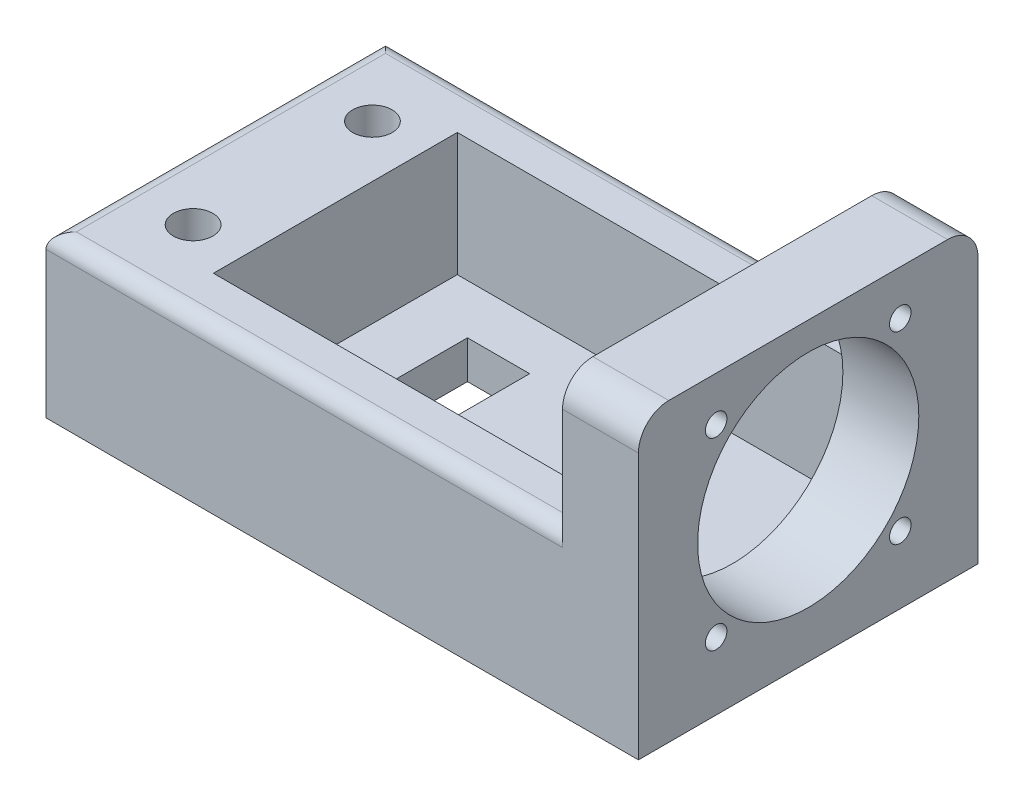
ISO-10303-21;
HEADER;
FILE_DESCRIPTION(('STEP AP214'),'2;1');
FILE_NAME('part.step','',(''),(''),'','','');
FILE_SCHEMA(('AUTOMOTIVE_DESIGN { 1 0 10303 214 1 1 1 1 }'));
ENDSEC;
DATA;
#1=APPLICATION_CONTEXT('core data for automotive mechanical design processes');
#2=APPLICATION_PROTOCOL_DEFINITION('international standard','automotive_design',2000,#1);
#3=PRODUCT_CONTEXT('',#1,'mechanical');
#4=PRODUCT('Part','Part','',(#3));
#5=PRODUCT_RELATED_PRODUCT_CATEGORY('part','',(#4));
#6=PRODUCT_DEFINITION_FORMATION('','',#4);
#7=PRODUCT_DEFINITION_CONTEXT('part definition',#1,'design');
#8=PRODUCT_DEFINITION('design','',#6,#7);
#9=PRODUCT_DEFINITION_SHAPE('','',#8);
#10=(LENGTH_UNIT() NAMED_UNIT(*) SI_UNIT(.MILLI.,.METRE.));
#11=(NAMED_UNIT(*) PLANE_ANGLE_UNIT() SI_UNIT($,.RADIAN.));
#12=(NAMED_UNIT(*) SI_UNIT($,.STERADIAN.) SOLID_ANGLE_UNIT());
#13=UNCERTAINTY_MEASURE_WITH_UNIT(LENGTH_MEASURE(1.E-05),#10,'distance_accuracy_value','');
#14=(GEOMETRIC_REPRESENTATION_CONTEXT(3) GLOBAL_UNCERTAINTY_ASSIGNED_CONTEXT((#13)) GLOBAL_UNIT_ASSIGNED_CONTEXT((#10,
#11,#12)) REPRESENTATION_CONTEXT('',''));
#15=CARTESIAN_POINT('',(0.,0.,0.));
#16=DIRECTION('',(0.,0.,1.));
#17=DIRECTION('',(1.,0.,0.));
#18=AXIS2_PLACEMENT_3D('',#15,#16,#17);
#19=CARTESIAN_POINT('',(0.,13.4747,0.));
#20=DIRECTION('',(0.,-1.,0.));
#21=DIRECTION('',(0.,0.,-1.));
#22=AXIS2_PLACEMENT_3D('',#19,#20,#21);
#23=PLANE('',#22);
#24=CARTESIAN_POINT('',(5.63499,13.4747,-21.6675));
#25=DIRECTION('',(0.,1.,0.));
#26=DIRECTION('',(0.,0.,1.));
#27=AXIS2_PLACEMENT_3D('',#24,#25,#26);
#28=CIRCLE('',#27,1.651);
#29=CARTESIAN_POINT('',(5.63499,13.4747,-20.0165));
#30=VERTEX_POINT('',#29);
#31=EDGE_CURVE('E335',#30,#30,#28,.T.);
#32=ORIENTED_EDGE('',*,*,#31,.F.);
#33=EDGE_LOOP('',(#32));
#34=FACE_BOUND('',#33,.T.);
#35=CARTESIAN_POINT('',(5.63499,13.4747,-6.6675));
#36=DIRECTION('',(0.,1.,0.));
#37=DIRECTION('',(0.,0.,1.));
#38=AXIS2_PLACEMENT_3D('',#35,#36,#37);
#39=CIRCLE('',#38,1.651);
#40=CARTESIAN_POINT('',(5.63499,13.4747,-5.01649999999999));
#41=VERTEX_POINT('',#40);
#42=EDGE_CURVE('E342',#41,#41,#39,.T.);
#43=ORIENTED_EDGE('',*,*,#42,.F.);
#44=EDGE_LOOP('',(#43));
#45=FACE_BOUND('',#44,.T.);
#46=DIRECTION('',(0.,0.,1.));
#47=VECTOR('',#46,1.);
#48=CARTESIAN_POINT('',(1.27,13.4747,0.));
#49=LINE('',#48,#47);
#50=CARTESIAN_POINT('',(1.27,13.4747,-27.12974));
#51=VERTEX_POINT('',#50);
#52=CARTESIAN_POINT('',(1.27,13.4747,-1.27));
#53=VERTEX_POINT('',#52);
#54=EDGE_CURVE('E303',#51,#53,#49,.T.);
#55=ORIENTED_EDGE('',*,*,#54,.T.);
#56=DIRECTION('',(1.,0.,0.));
#57=VECTOR('',#56,1.);
#58=CARTESIAN_POINT('',(0.,13.4747,-1.27));
#59=LINE('',#58,#57);
#60=CARTESIAN_POINT('',(43.20032,13.4747,-1.27));
#61=VERTEX_POINT('',#60);
#62=EDGE_CURVE('E309',#53,#61,#59,.T.);
#63=ORIENTED_EDGE('',*,*,#62,.T.);
#64=DIRECTION('',(0.,0.,1.));
#65=VECTOR('',#64,1.);
#66=CARTESIAN_POINT('',(43.20032,13.4747,0.));
#67=LINE('',#66,#65);
#68=CARTESIAN_POINT('',(43.20032,13.4747,-4.0005));
#69=VERTEX_POINT('',#68);
#70=EDGE_CURVE('E382',#69,#61,#67,.T.);
#71=ORIENTED_EDGE('',*,*,#70,.F.);
#72=DIRECTION('',(1.,0.,0.));
#73=VECTOR('',#72,1.);
#74=CARTESIAN_POINT('',(43.20032,13.4747,-4.0005));
#75=LINE('',#74,#73);
#76=CARTESIAN_POINT('',(9.99998,13.4747,-4.0005));
#77=VERTEX_POINT('',#76);
#78=EDGE_CURVE('E212',#77,#69,#75,.T.);
#79=ORIENTED_EDGE('',*,*,#78,.F.);
#80=DIRECTION('',(0.,0.,1.));
#81=VECTOR('',#80,1.);
#82=CARTESIAN_POINT('',(9.99998,13.4747,-24.39924));
#83=LINE('',#82,#81);
#84=CARTESIAN_POINT('',(9.99998,13.4747,-24.39924));
#85=VERTEX_POINT('',#84);
#86=EDGE_CURVE('E218',#85,#77,#83,.T.);
#87=ORIENTED_EDGE('',*,*,#86,.F.);
#88=DIRECTION('',(-1.,0.,0.));
#89=VECTOR('',#88,1.);
#90=CARTESIAN_POINT('',(43.20032,13.4747,-24.39924));
#91=LINE('',#90,#89);
#92=CARTESIAN_POINT('',(43.20032,13.4747,-24.39924));
#93=VERTEX_POINT('',#92);
#94=EDGE_CURVE('E226',#93,#85,#91,.T.);
#95=ORIENTED_EDGE('',*,*,#94,.F.);
#96=CARTESIAN_POINT('',(43.20032,13.4747,-27.12974));
#97=VERTEX_POINT('',#96);
#98=EDGE_CURVE('E188',#97,#93,#67,.T.);
#99=ORIENTED_EDGE('',*,*,#98,.F.);
#100=DIRECTION('',(-1.,0.,0.));
#101=VECTOR('',#100,1.);
#102=CARTESIAN_POINT('',(0.,13.4747,-27.12974));
#103=LINE('',#102,#101);
#104=EDGE_CURVE('E306',#97,#51,#103,.T.);
#105=ORIENTED_EDGE('',*,*,#104,.T.);
#106=EDGE_LOOP('',(#55,#63,#71,#79,#87,#95,#99,#105));
#107=FACE_BOUND('',#106,.T.);
#108=ADVANCED_FACE('F55',(#34,#45,#107),#23,.F.);
#109=CARTESIAN_POINT('',(43.20032,3.175,-4.0005));
#110=DIRECTION('',(0.,0.,1.));
#111=DIRECTION('',(1.,0.,0.));
#112=AXIS2_PLACEMENT_3D('',#109,#110,#111);
#113=PLANE('',#112);
#114=DIRECTION('',(0.,1.,0.));
#115=VECTOR('',#114,1.);
#116=CARTESIAN_POINT('',(43.20032,3.175,-4.0005));
#117=LINE('',#116,#115);
#118=CARTESIAN_POINT('',(43.20032,3.175,-4.0005));
#119=VERTEX_POINT('',#118);
#120=EDGE_CURVE('E381',#119,#69,#117,.T.);
#121=ORIENTED_EDGE('',*,*,#120,.F.);
#122=DIRECTION('',(1.,0.,0.));
#123=VECTOR('',#122,1.);
#124=CARTESIAN_POINT('',(43.20032,3.175,-4.0005));
#125=LINE('',#124,#123);
#126=CARTESIAN_POINT('',(9.99998,3.175,-4.0005));
#127=VERTEX_POINT('',#126);
#128=EDGE_CURVE('E201',#127,#119,#125,.T.);
#129=ORIENTED_EDGE('',*,*,#128,.F.);
#130=DIRECTION('',(0.,1.,0.));
#131=VECTOR('',#130,1.);
#132=CARTESIAN_POINT('',(9.99998,3.175,-4.0005));
#133=LINE('',#132,#131);
#134=EDGE_CURVE('E233',#127,#77,#133,.T.);
#135=ORIENTED_EDGE('',*,*,#134,.T.);
#136=ORIENTED_EDGE('',*,*,#78,.T.);
#137=EDGE_LOOP('',(#121,#129,#135,#136));
#138=FACE_BOUND('',#137,.T.);
#139=ADVANCED_FACE('F468',(#138),#113,.F.);
#140=CARTESIAN_POINT('',(43.20032,3.175,-24.39924));
#141=DIRECTION('',(0.,0.,-1.));
#142=DIRECTION('',(-1.,0.,0.));
#143=AXIS2_PLACEMENT_3D('',#140,#141,#142);
#144=PLANE('',#143);
#145=DIRECTION('',(0.,-1.,0.));
#146=VECTOR('',#145,1.);
#147=CARTESIAN_POINT('',(43.20032,3.175,-24.39924));
#148=LINE('',#147,#146);
#149=CARTESIAN_POINT('',(43.20032,3.175,-24.39924));
#150=VERTEX_POINT('',#149);
#151=EDGE_CURVE('E181',#93,#150,#148,.T.);
#152=ORIENTED_EDGE('',*,*,#151,.F.);
#153=ORIENTED_EDGE('',*,*,#94,.T.);
#154=DIRECTION('',(0.,1.,0.));
#155=VECTOR('',#154,1.);
#156=CARTESIAN_POINT('',(9.99998,3.175,-24.39924));
#157=LINE('',#156,#155);
#158=CARTESIAN_POINT('',(9.99998,3.175,-24.39924));
#159=VERTEX_POINT('',#158);
#160=EDGE_CURVE('E208',#159,#85,#157,.T.);
#161=ORIENTED_EDGE('',*,*,#160,.F.);
#162=DIRECTION('',(-1.,0.,0.));
#163=VECTOR('',#162,1.);
#164=CARTESIAN_POINT('',(43.20032,3.175,-24.39924));
#165=LINE('',#164,#163);
#166=EDGE_CURVE('E198',#150,#159,#165,.T.);
#167=ORIENTED_EDGE('',*,*,#166,.F.);
#168=EDGE_LOOP('',(#152,#153,#161,#167));
#169=FACE_BOUND('',#168,.T.);
#170=ADVANCED_FACE('F206',(#169),#144,.F.);
#171=CARTESIAN_POINT('',(0.,3.175,0.));
#172=DIRECTION('',(0.,-1.,0.));
#173=DIRECTION('',(0.,0.,-1.));
#174=AXIS2_PLACEMENT_3D('',#171,#172,#173);
#175=PLANE('',#174);
#176=DIRECTION('',(1.,0.,0.));
#177=VECTOR('',#176,1.);
#178=CARTESIAN_POINT('',(15.00124,3.175,-8.14959));
#179=LINE('',#178,#177);
#180=CARTESIAN_POINT('',(15.00124,3.175,-8.14959));
#181=VERTEX_POINT('',#180);
#182=CARTESIAN_POINT('',(20.20062,3.175,-8.14959));
#183=VERTEX_POINT('',#182);
#184=EDGE_CURVE('E416',#181,#183,#179,.T.);
#185=ORIENTED_EDGE('',*,*,#184,.F.);
#186=DIRECTION('',(0.,0.,1.));
#187=VECTOR('',#186,1.);
#188=CARTESIAN_POINT('',(15.00124,3.175,-20.25015));
#189=LINE('',#188,#187);
#190=CARTESIAN_POINT('',(15.00124,3.175,-20.25015));
#191=VERTEX_POINT('',#190);
#192=EDGE_CURVE('E396',#191,#181,#189,.T.);
#193=ORIENTED_EDGE('',*,*,#192,.F.);
#194=DIRECTION('',(-1.,0.,0.));
#195=VECTOR('',#194,1.);
#196=CARTESIAN_POINT('',(15.00124,3.175,-20.25015));
#197=LINE('',#196,#195);
#198=CARTESIAN_POINT('',(20.20062,3.175,-20.25015));
#199=VERTEX_POINT('',#198);
#200=EDGE_CURVE('E402',#199,#191,#197,.T.);
#201=ORIENTED_EDGE('',*,*,#200,.F.);
#202=DIRECTION('',(0.,0.,-1.));
#203=VECTOR('',#202,1.);
#204=CARTESIAN_POINT('',(20.20062,3.175,-20.25015));
#205=LINE('',#204,#203);
#206=EDGE_CURVE('E420',#183,#199,#205,.T.);
#207=ORIENTED_EDGE('',*,*,#206,.F.);
#208=EDGE_LOOP('',(#185,#193,#201,#207));
#209=FACE_BOUND('',#208,.T.);
#210=DIRECTION('',(0.,0.,1.));
#211=VECTOR('',#210,1.);
#212=CARTESIAN_POINT('',(43.20032,3.175,-28.39974));
#213=LINE('',#212,#211);
#214=EDGE_CURVE('E185',#150,#119,#213,.T.);
#215=ORIENTED_EDGE('',*,*,#214,.F.);
#216=ORIENTED_EDGE('',*,*,#166,.T.);
#217=DIRECTION('',(0.,0.,1.));
#218=VECTOR('',#217,1.);
#219=CARTESIAN_POINT('',(9.99998,3.175,-24.39924));
#220=LINE('',#219,#218);
#221=EDGE_CURVE('E211',#159,#127,#220,.T.);
#222=ORIENTED_EDGE('',*,*,#221,.T.);
#223=ORIENTED_EDGE('',*,*,#128,.T.);
#224=EDGE_LOOP('',(#215,#216,#222,#223));
#225=FACE_BOUND('',#224,.T.);
#226=ADVANCED_FACE('F196',(#209,#225),#175,.F.);
#227=CARTESIAN_POINT('',(0.,13.4747,0.));
#228=DIRECTION('',(1.,0.,0.));
#229=DIRECTION('',(0.,0.,-1.));
#230=AXIS2_PLACEMENT_3D('',#227,#228,#229);
#231=PLANE('',#230);
#232=DIRECTION('',(0.,-1.,0.));
#233=VECTOR('',#232,1.);
#234=CARTESIAN_POINT('',(0.,13.4747,0.));
#235=LINE('',#234,#233);
#236=CARTESIAN_POINT('',(0.,12.2047,0.));
#237=VERTEX_POINT('',#236);
#238=CARTESIAN_POINT('',(0.,0.,0.));
#239=VERTEX_POINT('',#238);
#240=EDGE_CURVE('E253',#237,#239,#235,.T.);
#241=ORIENTED_EDGE('',*,*,#240,.F.);
#242=DIRECTION('',(0.,0.,1.));
#243=VECTOR('',#242,1.);
#244=CARTESIAN_POINT('',(0.,12.2047,0.));
#245=LINE('',#244,#243);
#246=CARTESIAN_POINT('',(0.,12.2047,-28.39974));
#247=VERTEX_POINT('',#246);
#248=EDGE_CURVE('E80',#237,#247,#245,.F.);
#249=ORIENTED_EDGE('',*,*,#248,.T.);
#250=DIRECTION('',(0.,-1.,0.));
#251=VECTOR('',#250,1.);
#252=CARTESIAN_POINT('',(0.,13.4747,-28.39974));
#253=LINE('',#252,#251);
#254=CARTESIAN_POINT('',(0.,0.,-28.39974));
#255=VERTEX_POINT('',#254);
#256=EDGE_CURVE('E250',#247,#255,#253,.T.);
#257=ORIENTED_EDGE('',*,*,#256,.T.);
#258=DIRECTION('',(0.,0.,1.));
#259=VECTOR('',#258,1.);
#260=CARTESIAN_POINT('',(0.,0.,0.));
#261=LINE('',#260,#259);
#262=EDGE_CURVE('E236',#255,#239,#261,.T.);
#263=ORIENTED_EDGE('',*,*,#262,.T.);
#264=EDGE_LOOP('',(#241,#249,#257,#263));
#265=FACE_BOUND('',#264,.T.);
#266=ADVANCED_FACE('F490',(#265),#231,.F.);
#267=CARTESIAN_POINT('',(0.,13.4747,0.));
#268=DIRECTION('',(0.,0.,-1.));
#269=DIRECTION('',(-1.,0.,0.));
#270=AXIS2_PLACEMENT_3D('',#267,#268,#269);
#271=PLANE('',#270);
#272=DIRECTION('',(0.,-1.,0.));
#273=VECTOR('',#272,1.);
#274=CARTESIAN_POINT('',(43.20032,24.765,0.));
#275=LINE('',#274,#273);
#276=CARTESIAN_POINT('',(43.20032,22.225,0.));
#277=VERTEX_POINT('',#276);
#278=CARTESIAN_POINT('',(43.20032,12.2047,0.));
#279=VERTEX_POINT('',#278);
#280=EDGE_CURVE('E373',#277,#279,#275,.T.);
#281=ORIENTED_EDGE('',*,*,#280,.T.);
#282=DIRECTION('',(1.,0.,0.));
#283=VECTOR('',#282,1.);
#284=CARTESIAN_POINT('',(0.,12.2047,0.));
#285=LINE('',#284,#283);
#286=EDGE_CURVE('E313',#279,#237,#285,.F.);
#287=ORIENTED_EDGE('',*,*,#286,.T.);
#288=ORIENTED_EDGE('',*,*,#240,.T.);
#289=DIRECTION('',(1.,0.,0.));
#290=VECTOR('',#289,1.);
#291=CARTESIAN_POINT('',(0.,0.,0.));
#292=LINE('',#291,#290);
#293=CARTESIAN_POINT('',(49.55032,0.,0.));
#294=VERTEX_POINT('',#293);
#295=EDGE_CURVE('E242',#239,#294,#292,.T.);
#296=ORIENTED_EDGE('',*,*,#295,.T.);
#297=DIRECTION('',(0.,-1.,0.));
#298=VECTOR('',#297,1.);
#299=CARTESIAN_POINT('',(49.55032,13.4747,0.));
#300=LINE('',#299,#298);
#301=CARTESIAN_POINT('',(49.55032,22.225,0.));
#302=VERTEX_POINT('',#301);
#303=EDGE_CURVE('E385',#302,#294,#300,.T.);
#304=ORIENTED_EDGE('',*,*,#303,.F.);
#305=DIRECTION('',(1.,0.,0.));
#306=VECTOR('',#305,1.);
#307=CARTESIAN_POINT('',(0.,22.225,0.));
#308=LINE('',#307,#306);
#309=EDGE_CURVE('E300',#302,#277,#308,.F.);
#310=ORIENTED_EDGE('',*,*,#309,.T.);
#311=EDGE_LOOP('',(#281,#287,#288,#296,#304,#310));
#312=FACE_BOUND('',#311,.T.);
#313=ADVANCED_FACE('F486',(#312),#271,.F.);
#314=CARTESIAN_POINT('',(0.,13.4747,-28.39974));
#315=DIRECTION('',(0.,0.,1.));
#316=DIRECTION('',(1.,0.,0.));
#317=AXIS2_PLACEMENT_3D('',#314,#315,#316);
#318=PLANE('',#317);
#319=ORIENTED_EDGE('',*,*,#256,.F.);
#320=DIRECTION('',(-1.,0.,0.));
#321=VECTOR('',#320,1.);
#322=CARTESIAN_POINT('',(0.,12.2047,-28.39974));
#323=LINE('',#322,#321);
#324=CARTESIAN_POINT('',(43.20032,12.2047,-28.39974));
#325=VERTEX_POINT('',#324);
#326=EDGE_CURVE('E316',#247,#325,#323,.F.);
#327=ORIENTED_EDGE('',*,*,#326,.T.);
#328=DIRECTION('',(0.,-1.,0.));
#329=VECTOR('',#328,1.);
#330=CARTESIAN_POINT('',(43.20032,24.765,-28.39974));
#331=LINE('',#330,#329);
#332=CARTESIAN_POINT('',(43.20032,22.225,-28.39974));
#333=VERTEX_POINT('',#332);
#334=EDGE_CURVE('E72',#333,#325,#331,.T.);
#335=ORIENTED_EDGE('',*,*,#334,.F.);
#336=DIRECTION('',(1.,0.,0.));
#337=VECTOR('',#336,1.);
#338=CARTESIAN_POINT('',(0.,22.225,-28.39974));
#339=LINE('',#338,#337);
#340=CARTESIAN_POINT('',(49.55032,22.225,-28.39974));
#341=VERTEX_POINT('',#340);
#342=EDGE_CURVE('E256',#333,#341,#339,.T.);
#343=ORIENTED_EDGE('',*,*,#342,.T.);
#344=DIRECTION('',(0.,1.,0.));
#345=VECTOR('',#344,1.);
#346=CARTESIAN_POINT('',(49.55032,0.,-28.39974));
#347=LINE('',#346,#345);
#348=CARTESIAN_POINT('',(49.55032,0.,-28.39974));
#349=VERTEX_POINT('',#348);
#350=EDGE_CURVE('E392',#349,#341,#347,.T.);
#351=ORIENTED_EDGE('',*,*,#350,.F.);
#352=DIRECTION('',(-1.,0.,0.));
#353=VECTOR('',#352,1.);
#354=CARTESIAN_POINT('',(0.,0.,-28.39974));
#355=LINE('',#354,#353);
#356=EDGE_CURVE('E246',#349,#255,#355,.T.);
#357=ORIENTED_EDGE('',*,*,#356,.T.);
#358=EDGE_LOOP('',(#319,#327,#335,#343,#351,#357));
#359=FACE_BOUND('',#358,.T.);
#360=ADVANCED_FACE('F482',(#359),#318,.F.);
#361=CARTESIAN_POINT('',(0.,0.,0.));
#362=DIRECTION('',(0.,-1.,0.));
#363=DIRECTION('',(0.,0.,-1.));
#364=AXIS2_PLACEMENT_3D('',#361,#362,#363);
#365=PLANE('',#364);
#366=CARTESIAN_POINT('',(5.63499,0.,-21.6675));
#367=DIRECTION('',(0.,-1.,0.));
#368=DIRECTION('',(0.,0.,-1.));
#369=AXIS2_PLACEMENT_3D('',#366,#367,#368);
#370=CIRCLE('',#369,1.651);
#371=CARTESIAN_POINT('',(5.63499,0.,-23.3185));
#372=VERTEX_POINT('',#371);
#373=EDGE_CURVE('E59',#372,#372,#370,.T.);
#374=ORIENTED_EDGE('',*,*,#373,.F.);
#375=EDGE_LOOP('',(#374));
#376=FACE_BOUND('',#375,.T.);
#377=CARTESIAN_POINT('',(5.63499,0.,-6.6675));
#378=DIRECTION('',(0.,-1.,0.));
#379=DIRECTION('',(0.,0.,-1.));
#380=AXIS2_PLACEMENT_3D('',#377,#378,#379);
#381=CIRCLE('',#380,1.651);
#382=CARTESIAN_POINT('',(5.63499,0.,-8.3185));
#383=VERTEX_POINT('',#382);
#384=EDGE_CURVE('E332',#383,#383,#381,.T.);
#385=ORIENTED_EDGE('',*,*,#384,.F.);
#386=EDGE_LOOP('',(#385));
#387=FACE_BOUND('',#386,.T.);
#388=DIRECTION('',(0.,0.,1.));
#389=VECTOR('',#388,1.);
#390=CARTESIAN_POINT('',(15.00124,0.,-20.25015));
#391=LINE('',#390,#389);
#392=CARTESIAN_POINT('',(15.00124,0.,-20.25015));
#393=VERTEX_POINT('',#392);
#394=CARTESIAN_POINT('',(15.00124,0.,-8.14959));
#395=VERTEX_POINT('',#394);
#396=EDGE_CURVE('E397',#393,#395,#391,.T.);
#397=ORIENTED_EDGE('',*,*,#396,.T.);
#398=DIRECTION('',(1.,0.,0.));
#399=VECTOR('',#398,1.);
#400=CARTESIAN_POINT('',(15.00124,0.,-8.14959));
#401=LINE('',#400,#399);
#402=CARTESIAN_POINT('',(20.20062,0.,-8.14959));
#403=VERTEX_POINT('',#402);
#404=EDGE_CURVE('E401',#395,#403,#401,.T.);
#405=ORIENTED_EDGE('',*,*,#404,.T.);
#406=DIRECTION('',(0.,0.,-1.));
#407=VECTOR('',#406,1.);
#408=CARTESIAN_POINT('',(20.20062,0.,-20.25015));
#409=LINE('',#408,#407);
#410=CARTESIAN_POINT('',(20.20062,0.,-20.25015));
#411=VERTEX_POINT('',#410);
#412=EDGE_CURVE('E406',#403,#411,#409,.T.);
#413=ORIENTED_EDGE('',*,*,#412,.T.);
#414=DIRECTION('',(-1.,0.,0.));
#415=VECTOR('',#414,1.);
#416=CARTESIAN_POINT('',(15.00124,0.,-20.25015));
#417=LINE('',#416,#415);
#418=EDGE_CURVE('E410',#411,#393,#417,.T.);
#419=ORIENTED_EDGE('',*,*,#418,.T.);
#420=EDGE_LOOP('',(#397,#405,#413,#419));
#421=FACE_BOUND('',#420,.T.);
#422=ORIENTED_EDGE('',*,*,#262,.F.);
#423=ORIENTED_EDGE('',*,*,#356,.F.);
#424=DIRECTION('',(0.,0.,-1.));
#425=VECTOR('',#424,1.);
#426=CARTESIAN_POINT('',(49.55032,0.,0.));
#427=LINE('',#426,#425);
#428=EDGE_CURVE('E388',#294,#349,#427,.T.);
#429=ORIENTED_EDGE('',*,*,#428,.F.);
#430=ORIENTED_EDGE('',*,*,#295,.F.);
#431=EDGE_LOOP('',(#422,#423,#429,#430));
#432=FACE_BOUND('',#431,.T.);
#433=ADVANCED_FACE('F452',(#376,#387,#421,#432),#365,.T.);
#434=CARTESIAN_POINT('',(9.99998,3.175,-24.39924));
#435=DIRECTION('',(-1.,0.,0.));
#436=DIRECTION('',(0.,0.,1.));
#437=AXIS2_PLACEMENT_3D('',#434,#435,#436);
#438=PLANE('',#437);
#439=ORIENTED_EDGE('',*,*,#86,.T.);
#440=ORIENTED_EDGE('',*,*,#134,.F.);
#441=ORIENTED_EDGE('',*,*,#221,.F.);
#442=ORIENTED_EDGE('',*,*,#160,.T.);
#443=EDGE_LOOP('',(#439,#440,#441,#442));
#444=FACE_BOUND('',#443,.T.);
#445=ADVANCED_FACE('F456',(#444),#438,.F.);
#446=CARTESIAN_POINT('',(15.00124,0.,-20.25015));
#447=DIRECTION('',(-1.,0.,0.));
#448=DIRECTION('',(0.,0.,1.));
#449=AXIS2_PLACEMENT_3D('',#446,#447,#448);
#450=PLANE('',#449);
#451=ORIENTED_EDGE('',*,*,#192,.T.);
#452=DIRECTION('',(0.,1.,0.));
#453=VECTOR('',#452,1.);
#454=CARTESIAN_POINT('',(15.00124,0.,-8.14959));
#455=LINE('',#454,#453);
#456=EDGE_CURVE('E221',#395,#181,#455,.T.);
#457=ORIENTED_EDGE('',*,*,#456,.F.);
#458=ORIENTED_EDGE('',*,*,#396,.F.);
#459=DIRECTION('',(0.,1.,0.));
#460=VECTOR('',#459,1.);
#461=CARTESIAN_POINT('',(15.00124,0.,-20.25015));
#462=LINE('',#461,#460);
#463=EDGE_CURVE('E229',#393,#191,#462,.T.);
#464=ORIENTED_EDGE('',*,*,#463,.T.);
#465=EDGE_LOOP('',(#451,#457,#458,#464));
#466=FACE_BOUND('',#465,.T.);
#467=ADVANCED_FACE('F454',(#466),#450,.F.);
#468=CARTESIAN_POINT('',(15.00124,0.,-20.25015));
#469=DIRECTION('',(0.,0.,-1.));
#470=DIRECTION('',(-1.,0.,0.));
#471=AXIS2_PLACEMENT_3D('',#468,#469,#470);
#472=PLANE('',#471);
#473=ORIENTED_EDGE('',*,*,#200,.T.);
#474=ORIENTED_EDGE('',*,*,#463,.F.);
#475=ORIENTED_EDGE('',*,*,#418,.F.);
#476=DIRECTION('',(0.,1.,0.));
#477=VECTOR('',#476,1.);
#478=CARTESIAN_POINT('',(20.20062,0.,-20.25015));
#479=LINE('',#478,#477);
#480=EDGE_CURVE('E429',#411,#199,#479,.T.);
#481=ORIENTED_EDGE('',*,*,#480,.T.);
#482=EDGE_LOOP('',(#473,#474,#475,#481));
#483=FACE_BOUND('',#482,.T.);
#484=ADVANCED_FACE('F450',(#483),#472,.F.);
#485=CARTESIAN_POINT('',(20.20062,0.,-20.25015));
#486=DIRECTION('',(1.,0.,0.));
#487=DIRECTION('',(0.,0.,-1.));
#488=AXIS2_PLACEMENT_3D('',#485,#486,#487);
#489=PLANE('',#488);
#490=ORIENTED_EDGE('',*,*,#206,.T.);
#491=ORIENTED_EDGE('',*,*,#480,.F.);
#492=ORIENTED_EDGE('',*,*,#412,.F.);
#493=DIRECTION('',(0.,1.,0.));
#494=VECTOR('',#493,1.);
#495=CARTESIAN_POINT('',(20.20062,0.,-8.14959));
#496=LINE('',#495,#494);
#497=EDGE_CURVE('E431',#403,#183,#496,.T.);
#498=ORIENTED_EDGE('',*,*,#497,.T.);
#499=EDGE_LOOP('',(#490,#491,#492,#498));
#500=FACE_BOUND('',#499,.T.);
#501=ADVANCED_FACE('F447',(#500),#489,.F.);
#502=CARTESIAN_POINT('',(15.00124,0.,-8.14959));
#503=DIRECTION('',(0.,0.,1.));
#504=DIRECTION('',(1.,0.,0.));
#505=AXIS2_PLACEMENT_3D('',#502,#503,#504);
#506=PLANE('',#505);
#507=ORIENTED_EDGE('',*,*,#184,.T.);
#508=ORIENTED_EDGE('',*,*,#497,.F.);
#509=ORIENTED_EDGE('',*,*,#404,.F.);
#510=ORIENTED_EDGE('',*,*,#456,.T.);
#511=EDGE_LOOP('',(#507,#508,#509,#510));
#512=FACE_BOUND('',#511,.T.);
#513=ADVANCED_FACE('F440',(#512),#506,.F.);
#514=CARTESIAN_POINT('',(49.55032,0.,0.));
#515=DIRECTION('',(-1.,0.,0.));
#516=DIRECTION('',(0.,0.,1.));
#517=AXIS2_PLACEMENT_3D('',#514,#515,#516);
#518=PLANE('',#517);
#519=CARTESIAN_POINT('',(49.55032,5.639,-6.49987));
#520=DIRECTION('',(1.,0.,0.));
#521=DIRECTION('',(0.,0.,-1.));
#522=AXIS2_PLACEMENT_3D('',#519,#520,#521);
#523=CIRCLE('',#522,0.899999999999999);
#524=CARTESIAN_POINT('',(49.55032,5.639,-7.39987));
#525=VERTEX_POINT('',#524);
#526=EDGE_CURVE('E331',#525,#525,#523,.T.);
#527=ORIENTED_EDGE('',*,*,#526,.F.);
#528=EDGE_LOOP('',(#527));
#529=FACE_BOUND('',#528,.T.);
#530=CARTESIAN_POINT('',(49.55032,5.639,-21.89987));
#531=DIRECTION('',(1.,0.,0.));
#532=DIRECTION('',(0.,0.,-1.));
#533=AXIS2_PLACEMENT_3D('',#530,#531,#532);
#534=CIRCLE('',#533,0.9);
#535=CARTESIAN_POINT('',(49.55032,5.639,-22.79987));
#536=VERTEX_POINT('',#535);
#537=EDGE_CURVE('E354',#536,#536,#534,.T.);
#538=ORIENTED_EDGE('',*,*,#537,.F.);
#539=EDGE_LOOP('',(#538));
#540=FACE_BOUND('',#539,.T.);
#541=CARTESIAN_POINT('',(49.55032,21.039,-21.89987));
#542=DIRECTION('',(1.,0.,0.));
#543=DIRECTION('',(0.,0.,-1.));
#544=AXIS2_PLACEMENT_3D('',#541,#542,#543);
#545=CIRCLE('',#544,0.900000000000001);
#546=CARTESIAN_POINT('',(49.55032,21.039,-22.79987));
#547=VERTEX_POINT('',#546);
#548=EDGE_CURVE('E350',#547,#547,#545,.T.);
#549=ORIENTED_EDGE('',*,*,#548,.F.);
#550=EDGE_LOOP('',(#549));
#551=FACE_BOUND('',#550,.T.);
#552=CARTESIAN_POINT('',(49.55032,21.039,-6.49987));
#553=DIRECTION('',(1.,0.,0.));
#554=DIRECTION('',(0.,0.,-1.));
#555=AXIS2_PLACEMENT_3D('',#552,#553,#554);
#556=CIRCLE('',#555,0.9);
#557=CARTESIAN_POINT('',(49.55032,21.039,-7.39987));
#558=VERTEX_POINT('',#557);
#559=EDGE_CURVE('E266',#558,#558,#556,.T.);
#560=ORIENTED_EDGE('',*,*,#559,.F.);
#561=EDGE_LOOP('',(#560));
#562=FACE_BOUND('',#561,.T.);
#563=CARTESIAN_POINT('',(49.55032,13.177,-14.19987));
#564=DIRECTION('',(1.,0.,0.));
#565=DIRECTION('',(0.,0.,-1.));
#566=AXIS2_PLACEMENT_3D('',#563,#564,#565);
#567=CIRCLE('',#566,9.25);
#568=CARTESIAN_POINT('',(49.55032,13.177,-23.44987));
#569=VERTEX_POINT('',#568);
#570=EDGE_CURVE('E260',#569,#569,#567,.T.);
#571=ORIENTED_EDGE('',*,*,#570,.F.);
#572=EDGE_LOOP('',(#571));
#573=FACE_BOUND('',#572,.T.);
#574=ORIENTED_EDGE('',*,*,#350,.T.);
#575=CARTESIAN_POINT('',(49.55032,22.225,-25.85974));
#576=DIRECTION('',(-1.,0.,0.));
#577=DIRECTION('',(0.,0.,1.));
#578=AXIS2_PLACEMENT_3D('',#575,#576,#577);
#579=CIRCLE('',#578,2.54);
#580=CARTESIAN_POINT('',(49.55032,24.765,-25.85974));
#581=VERTEX_POINT('',#580);
#582=EDGE_CURVE('E284',#341,#581,#579,.F.);
#583=ORIENTED_EDGE('',*,*,#582,.T.);
#584=DIRECTION('',(0.,0.,1.));
#585=VECTOR('',#584,1.);
#586=CARTESIAN_POINT('',(49.55032,24.765,-28.39974));
#587=LINE('',#586,#585);
#588=CARTESIAN_POINT('',(49.55032,24.765,-2.54000000000001));
#589=VERTEX_POINT('',#588);
#590=EDGE_CURVE('E203',#581,#589,#587,.T.);
#591=ORIENTED_EDGE('',*,*,#590,.T.);
#592=CARTESIAN_POINT('',(49.55032,22.225,-2.54));
#593=DIRECTION('',(-1.,0.,0.));
#594=DIRECTION('',(0.,0.,1.));
#595=AXIS2_PLACEMENT_3D('',#592,#593,#594);
#596=CIRCLE('',#595,2.54);
#597=EDGE_CURVE('E281',#589,#302,#596,.F.);
#598=ORIENTED_EDGE('',*,*,#597,.T.);
#599=ORIENTED_EDGE('',*,*,#303,.T.);
#600=ORIENTED_EDGE('',*,*,#428,.T.);
#601=EDGE_LOOP('',(#574,#583,#591,#598,#599,#600));
#602=FACE_BOUND('',#601,.T.);
#603=ADVANCED_FACE('F542',(#529,#540,#551,#562,#573,#602),#518,.F.);
#604=CARTESIAN_POINT('',(43.20032,24.765,-28.39974));
#605=DIRECTION('',(1.,0.,0.));
#606=DIRECTION('',(0.,0.,-1.));
#607=AXIS2_PLACEMENT_3D('',#604,#605,#606);
#608=PLANE('',#607);
#609=CARTESIAN_POINT('',(43.20032,5.639,-6.49987));
#610=DIRECTION('',(1.,0.,0.));
#611=DIRECTION('',(0.,0.,-1.));
#612=AXIS2_PLACEMENT_3D('',#609,#610,#611);
#613=CIRCLE('',#612,0.899999999999999);
#614=CARTESIAN_POINT('',(43.20032,5.639,-7.39987));
#615=VERTEX_POINT('',#614);
#616=EDGE_CURVE('E274',#615,#615,#613,.T.);
#617=ORIENTED_EDGE('',*,*,#616,.T.);
#618=EDGE_LOOP('',(#617));
#619=FACE_BOUND('',#618,.T.);
#620=CARTESIAN_POINT('',(43.20032,5.639,-21.89987));
#621=DIRECTION('',(1.,0.,0.));
#622=DIRECTION('',(0.,0.,-1.));
#623=AXIS2_PLACEMENT_3D('',#620,#621,#622);
#624=CIRCLE('',#623,0.9);
#625=CARTESIAN_POINT('',(43.20032,5.639,-22.79987));
#626=VERTEX_POINT('',#625);
#627=EDGE_CURVE('E270',#626,#626,#624,.T.);
#628=ORIENTED_EDGE('',*,*,#627,.T.);
#629=EDGE_LOOP('',(#628));
#630=FACE_BOUND('',#629,.T.);
#631=CARTESIAN_POINT('',(43.20032,21.039,-21.89987));
#632=DIRECTION('',(1.,0.,0.));
#633=DIRECTION('',(0.,0.,-1.));
#634=AXIS2_PLACEMENT_3D('',#631,#632,#633);
#635=CIRCLE('',#634,0.900000000000001);
#636=CARTESIAN_POINT('',(43.20032,21.039,-22.79987));
#637=VERTEX_POINT('',#636);
#638=EDGE_CURVE('E265',#637,#637,#635,.T.);
#639=ORIENTED_EDGE('',*,*,#638,.T.);
#640=EDGE_LOOP('',(#639));
#641=FACE_BOUND('',#640,.T.);
#642=CARTESIAN_POINT('',(43.20032,21.039,-6.49987));
#643=DIRECTION('',(1.,0.,0.));
#644=DIRECTION('',(0.,0.,-1.));
#645=AXIS2_PLACEMENT_3D('',#642,#643,#644);
#646=CIRCLE('',#645,0.9);
#647=CARTESIAN_POINT('',(43.20032,21.039,-7.39987));
#648=VERTEX_POINT('',#647);
#649=EDGE_CURVE('E261',#648,#648,#646,.T.);
#650=ORIENTED_EDGE('',*,*,#649,.T.);
#651=EDGE_LOOP('',(#650));
#652=FACE_BOUND('',#651,.T.);
#653=CARTESIAN_POINT('',(43.20032,13.177,-14.19987));
#654=DIRECTION('',(1.,0.,0.));
#655=DIRECTION('',(0.,0.,-1.));
#656=AXIS2_PLACEMENT_3D('',#653,#654,#655);
#657=CIRCLE('',#656,9.25);
#658=CARTESIAN_POINT('',(43.20032,13.177,-23.44987));
#659=VERTEX_POINT('',#658);
#660=EDGE_CURVE('E204',#659,#659,#657,.T.);
#661=ORIENTED_EDGE('',*,*,#660,.T.);
#662=EDGE_LOOP('',(#661));
#663=FACE_BOUND('',#662,.T.);
#664=DIRECTION('',(0.,0.,1.));
#665=VECTOR('',#664,1.);
#666=CARTESIAN_POINT('',(43.20032,24.765,-28.39974));
#667=LINE('',#666,#665);
#668=CARTESIAN_POINT('',(43.20032,24.765,-25.85974));
#669=VERTEX_POINT('',#668);
#670=CARTESIAN_POINT('',(43.20032,24.765,-2.54000000000001));
#671=VERTEX_POINT('',#670);
#672=EDGE_CURVE('E370',#669,#671,#667,.T.);
#673=ORIENTED_EDGE('',*,*,#672,.F.);
#674=CARTESIAN_POINT('',(43.20032,22.225,-25.85974));
#675=DIRECTION('',(1.,0.,0.));
#676=DIRECTION('',(0.,0.,-1.));
#677=AXIS2_PLACEMENT_3D('',#674,#675,#676);
#678=CIRCLE('',#677,2.54);
#679=EDGE_CURVE('E297',#669,#333,#678,.F.);
#680=ORIENTED_EDGE('',*,*,#679,.T.);
#681=ORIENTED_EDGE('',*,*,#334,.T.);
#682=CARTESIAN_POINT('',(43.20032,12.2047,-27.12974));
#683=DIRECTION('',(1.,0.,0.));
#684=DIRECTION('',(0.,0.,-1.));
#685=AXIS2_PLACEMENT_3D('',#682,#683,#684);
#686=CIRCLE('',#685,1.27);
#687=EDGE_CURVE('E11',#325,#97,#686,.T.);
#688=ORIENTED_EDGE('',*,*,#687,.T.);
#689=ORIENTED_EDGE('',*,*,#98,.T.);
#690=ORIENTED_EDGE('',*,*,#151,.T.);
#691=ORIENTED_EDGE('',*,*,#214,.T.);
#692=ORIENTED_EDGE('',*,*,#120,.T.);
#693=ORIENTED_EDGE('',*,*,#70,.T.);
#694=CARTESIAN_POINT('',(43.20032,12.2047,-1.27));
#695=DIRECTION('',(1.,0.,0.));
#696=DIRECTION('',(0.,0.,-1.));
#697=AXIS2_PLACEMENT_3D('',#694,#695,#696);
#698=CIRCLE('',#697,1.27);
#699=EDGE_CURVE('E65',#61,#279,#698,.T.);
#700=ORIENTED_EDGE('',*,*,#699,.T.);
#701=ORIENTED_EDGE('',*,*,#280,.F.);
#702=CARTESIAN_POINT('',(43.20032,22.225,-2.54));
#703=DIRECTION('',(1.,0.,0.));
#704=DIRECTION('',(0.,0.,-1.));
#705=AXIS2_PLACEMENT_3D('',#702,#703,#704);
#706=CIRCLE('',#705,2.54);
#707=EDGE_CURVE('E294',#277,#671,#706,.F.);
#708=ORIENTED_EDGE('',*,*,#707,.T.);
#709=EDGE_LOOP('',(#673,#680,#681,#688,#689,#690,#691,#692,#693,#700,#701,#708));
#710=FACE_BOUND('',#709,.T.);
#711=ADVANCED_FACE('F184',(#619,#630,#641,#652,#663,#710),#608,.F.);
#712=CARTESIAN_POINT('',(0.,24.765,0.));
#713=DIRECTION('',(0.,-1.,0.));
#714=DIRECTION('',(0.,0.,-1.));
#715=AXIS2_PLACEMENT_3D('',#712,#713,#714);
#716=PLANE('',#715);
#717=ORIENTED_EDGE('',*,*,#590,.F.);
#718=DIRECTION('',(1.,0.,0.));
#719=VECTOR('',#718,1.);
#720=CARTESIAN_POINT('',(0.,24.765,-25.85974));
#721=LINE('',#720,#719);
#722=EDGE_CURVE('E291',#581,#669,#721,.F.);
#723=ORIENTED_EDGE('',*,*,#722,.T.);
#724=ORIENTED_EDGE('',*,*,#672,.T.);
#725=DIRECTION('',(1.,0.,0.));
#726=VECTOR('',#725,1.);
#727=CARTESIAN_POINT('',(0.,24.765,-2.54));
#728=LINE('',#727,#726);
#729=EDGE_CURVE('E287',#671,#589,#728,.T.);
#730=ORIENTED_EDGE('',*,*,#729,.T.);
#731=EDGE_LOOP('',(#717,#723,#724,#730));
#732=FACE_BOUND('',#731,.T.);
#733=ADVANCED_FACE('F539',(#732),#716,.F.);
#734=CARTESIAN_POINT('',(24.15032,13.177,-14.19987));
#735=DIRECTION('',(1.,0.,0.));
#736=DIRECTION('',(0.,0.,-1.));
#737=AXIS2_PLACEMENT_3D('',#734,#735,#736);
#738=CYLINDRICAL_SURFACE('',#737,9.25);
#739=ORIENTED_EDGE('',*,*,#570,.T.);
#740=EDGE_LOOP('',(#739));
#741=FACE_BOUND('',#740,.T.);
#742=ORIENTED_EDGE('',*,*,#660,.F.);
#743=EDGE_LOOP('',(#742));
#744=FACE_BOUND('',#743,.T.);
#745=ADVANCED_FACE('F596',(#741,#744),#738,.F.);
#746=CARTESIAN_POINT('',(24.15032,21.039,-6.49987));
#747=DIRECTION('',(1.,0.,0.));
#748=DIRECTION('',(0.,0.,-1.));
#749=AXIS2_PLACEMENT_3D('',#746,#747,#748);
#750=CYLINDRICAL_SURFACE('',#749,0.9);
#751=ORIENTED_EDGE('',*,*,#559,.T.);
#752=EDGE_LOOP('',(#751));
#753=FACE_BOUND('',#752,.T.);
#754=ORIENTED_EDGE('',*,*,#649,.F.);
#755=EDGE_LOOP('',(#754));
#756=FACE_BOUND('',#755,.T.);
#757=ADVANCED_FACE('F600',(#753,#756),#750,.F.);
#758=CARTESIAN_POINT('',(24.15032,21.039,-21.89987));
#759=DIRECTION('',(1.,0.,0.));
#760=DIRECTION('',(0.,0.,-1.));
#761=AXIS2_PLACEMENT_3D('',#758,#759,#760);
#762=CYLINDRICAL_SURFACE('',#761,0.900000000000001);
#763=ORIENTED_EDGE('',*,*,#548,.T.);
#764=EDGE_LOOP('',(#763));
#765=FACE_BOUND('',#764,.T.);
#766=ORIENTED_EDGE('',*,*,#638,.F.);
#767=EDGE_LOOP('',(#766));
#768=FACE_BOUND('',#767,.T.);
#769=ADVANCED_FACE('F610',(#765,#768),#762,.F.);
#770=CARTESIAN_POINT('',(24.15032,5.639,-21.89987));
#771=DIRECTION('',(1.,0.,0.));
#772=DIRECTION('',(0.,0.,-1.));
#773=AXIS2_PLACEMENT_3D('',#770,#771,#772);
#774=CYLINDRICAL_SURFACE('',#773,0.9);
#775=ORIENTED_EDGE('',*,*,#537,.T.);
#776=EDGE_LOOP('',(#775));
#777=FACE_BOUND('',#776,.T.);
#778=ORIENTED_EDGE('',*,*,#627,.F.);
#779=EDGE_LOOP('',(#778));
#780=FACE_BOUND('',#779,.T.);
#781=ADVANCED_FACE('F619',(#777,#780),#774,.F.);
#782=CARTESIAN_POINT('',(24.15032,5.639,-6.49987));
#783=DIRECTION('',(1.,0.,0.));
#784=DIRECTION('',(0.,0.,-1.));
#785=AXIS2_PLACEMENT_3D('',#782,#783,#784);
#786=CYLINDRICAL_SURFACE('',#785,0.899999999999999);
#787=ORIENTED_EDGE('',*,*,#526,.T.);
#788=EDGE_LOOP('',(#787));
#789=FACE_BOUND('',#788,.T.);
#790=ORIENTED_EDGE('',*,*,#616,.F.);
#791=EDGE_LOOP('',(#790));
#792=FACE_BOUND('',#791,.T.);
#793=ADVANCED_FACE('F498',(#789,#792),#786,.F.);
#794=CARTESIAN_POINT('',(0.,22.225,-25.85974));
#795=DIRECTION('',(1.,0.,0.));
#796=DIRECTION('',(0.,0.,-1.));
#797=AXIS2_PLACEMENT_3D('',#794,#795,#796);
#798=CYLINDRICAL_SURFACE('',#797,2.54);
#799=ORIENTED_EDGE('',*,*,#679,.F.);
#800=ORIENTED_EDGE('',*,*,#722,.F.);
#801=ORIENTED_EDGE('',*,*,#582,.F.);
#802=ORIENTED_EDGE('',*,*,#342,.F.);
#803=EDGE_LOOP('',(#799,#800,#801,#802));
#804=FACE_BOUND('',#803,.T.);
#805=ADVANCED_FACE('F494',(#804),#798,.T.);
#806=CARTESIAN_POINT('',(0.,22.225,-2.54));
#807=DIRECTION('',(1.,0.,0.));
#808=DIRECTION('',(0.,0.,-1.));
#809=AXIS2_PLACEMENT_3D('',#806,#807,#808);
#810=CYLINDRICAL_SURFACE('',#809,2.54);
#811=ORIENTED_EDGE('',*,*,#707,.F.);
#812=ORIENTED_EDGE('',*,*,#309,.F.);
#813=ORIENTED_EDGE('',*,*,#597,.F.);
#814=ORIENTED_EDGE('',*,*,#729,.F.);
#815=EDGE_LOOP('',(#811,#812,#813,#814));
#816=FACE_BOUND('',#815,.T.);
#817=ADVANCED_FACE('F497',(#816),#810,.T.);
#818=CARTESIAN_POINT('',(0.,12.2047,-27.12974));
#819=DIRECTION('',(-1.,0.,0.));
#820=DIRECTION('',(0.,0.,1.));
#821=AXIS2_PLACEMENT_3D('',#818,#819,#820);
#822=CYLINDRICAL_SURFACE('',#821,1.27);
#823=ORIENTED_EDGE('',*,*,#687,.F.);
#824=ORIENTED_EDGE('',*,*,#326,.F.);
#825=CARTESIAN_POINT('',(1.27,12.2047,-27.12974));
#826=DIRECTION('',(-0.707106781186547,0.,0.707106781186547));
#827=DIRECTION('',(0.707106781186547,0.,0.707106781186547));
#828=AXIS2_PLACEMENT_3D('',#825,#826,#827);
#829=ELLIPSE('',#828,1.79605122421383,1.27);
#830=EDGE_CURVE('E328',#51,#247,#829,.T.);
#831=ORIENTED_EDGE('',*,*,#830,.F.);
#832=ORIENTED_EDGE('',*,*,#104,.F.);
#833=EDGE_LOOP('',(#823,#824,#831,#832));
#834=FACE_BOUND('',#833,.T.);
#835=ADVANCED_FACE('F57',(#834),#822,.T.);
#836=CARTESIAN_POINT('',(1.27,12.2047,0.));
#837=DIRECTION('',(0.,0.,1.));
#838=DIRECTION('',(1.,0.,0.));
#839=AXIS2_PLACEMENT_3D('',#836,#837,#838);
#840=CYLINDRICAL_SURFACE('',#839,1.27);
#841=ORIENTED_EDGE('',*,*,#830,.T.);
#842=ORIENTED_EDGE('',*,*,#248,.F.);
#843=CARTESIAN_POINT('',(1.27,12.2047,-1.27));
#844=DIRECTION('',(0.707106781186547,0.,0.707106781186547));
#845=DIRECTION('',(-0.707106781186547,0.,0.707106781186547));
#846=AXIS2_PLACEMENT_3D('',#843,#844,#845);
#847=ELLIPSE('',#846,1.79605122421383,1.27);
#848=EDGE_CURVE('E324',#53,#237,#847,.T.);
#849=ORIENTED_EDGE('',*,*,#848,.F.);
#850=ORIENTED_EDGE('',*,*,#54,.F.);
#851=EDGE_LOOP('',(#841,#842,#849,#850));
#852=FACE_BOUND('',#851,.T.);
#853=ADVANCED_FACE('F505',(#852),#840,.T.);
#854=CARTESIAN_POINT('',(0.,12.2047,-1.27));
#855=DIRECTION('',(1.,0.,0.));
#856=DIRECTION('',(0.,0.,-1.));
#857=AXIS2_PLACEMENT_3D('',#854,#855,#856);
#858=CYLINDRICAL_SURFACE('',#857,1.27);
#859=ORIENTED_EDGE('',*,*,#848,.T.);
#860=ORIENTED_EDGE('',*,*,#286,.F.);
#861=ORIENTED_EDGE('',*,*,#699,.F.);
#862=ORIENTED_EDGE('',*,*,#62,.F.);
#863=EDGE_LOOP('',(#859,#860,#861,#862));
#864=FACE_BOUND('',#863,.T.);
#865=ADVANCED_FACE('F503',(#864),#858,.T.);
#866=CARTESIAN_POINT('',(5.63499,-11.9253,-6.6675));
#867=DIRECTION('',(0.,1.,0.));
#868=DIRECTION('',(0.,0.,1.));
#869=AXIS2_PLACEMENT_3D('',#866,#867,#868);
#870=CYLINDRICAL_SURFACE('',#869,1.651);
#871=ORIENTED_EDGE('',*,*,#384,.T.);
#872=EDGE_LOOP('',(#871));
#873=FACE_BOUND('',#872,.T.);
#874=ORIENTED_EDGE('',*,*,#42,.T.);
#875=EDGE_LOOP('',(#874));
#876=FACE_BOUND('',#875,.T.);
#877=ADVANCED_FACE('F504',(#873,#876),#870,.F.);
#878=CARTESIAN_POINT('',(5.63499,-11.9253,-21.6675));
#879=DIRECTION('',(0.,1.,0.));
#880=DIRECTION('',(0.,0.,1.));
#881=AXIS2_PLACEMENT_3D('',#878,#879,#880);
#882=CYLINDRICAL_SURFACE('',#881,1.651);
#883=ORIENTED_EDGE('',*,*,#373,.T.);
#884=EDGE_LOOP('',(#883));
#885=FACE_BOUND('',#884,.T.);
#886=ORIENTED_EDGE('',*,*,#31,.T.);
#887=EDGE_LOOP('',(#886));
#888=FACE_BOUND('',#887,.T.);
#889=ADVANCED_FACE('F674',(#885,#888),#882,.F.);
#890=CLOSED_SHELL('',(#108,#139,#170,#226,#266,#313,#360,#433,#445,#467,#484,#501,#513,#603,
#711,#733,#745,#757,#769,#781,#793,#805,#817,#835,#853,#865,#877,#889));
#891=MANIFOLD_SOLID_BREP('B2',#890);
#892=ADVANCED_BREP_SHAPE_REPRESENTATION('',(#18,#891),#14);
#893=SHAPE_DEFINITION_REPRESENTATION(#9,#892);
ENDSEC;
END-ISO-10303-21;
